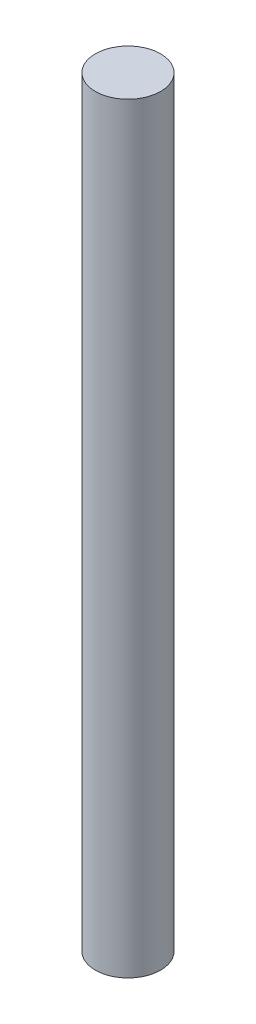
ISO-10303-21;
HEADER;
FILE_DESCRIPTION(('STEP AP214'),'2;1');
FILE_NAME('part.step','',(''),(''),'','','');
FILE_SCHEMA(('AUTOMOTIVE_DESIGN { 1 0 10303 214 1 1 1 1 }'));
ENDSEC;
DATA;
#1=APPLICATION_CONTEXT('core data for automotive mechanical design processes');
#2=APPLICATION_PROTOCOL_DEFINITION('international standard','automotive_design',2000,#1);
#3=PRODUCT_CONTEXT('',#1,'mechanical');
#4=PRODUCT('Part','Part','',(#3));
#5=PRODUCT_RELATED_PRODUCT_CATEGORY('part','',(#4));
#6=PRODUCT_DEFINITION_FORMATION('','',#4);
#7=PRODUCT_DEFINITION_CONTEXT('part definition',#1,'design');
#8=PRODUCT_DEFINITION('design','',#6,#7);
#9=PRODUCT_DEFINITION_SHAPE('','',#8);
#10=(LENGTH_UNIT() NAMED_UNIT(*) SI_UNIT(.MILLI.,.METRE.));
#11=(NAMED_UNIT(*) PLANE_ANGLE_UNIT() SI_UNIT($,.RADIAN.));
#12=(NAMED_UNIT(*) SI_UNIT($,.STERADIAN.) SOLID_ANGLE_UNIT());
#13=UNCERTAINTY_MEASURE_WITH_UNIT(LENGTH_MEASURE(1.E-05),#10,'distance_accuracy_value','');
#14=(GEOMETRIC_REPRESENTATION_CONTEXT(3) GLOBAL_UNCERTAINTY_ASSIGNED_CONTEXT((#13)) GLOBAL_UNIT_ASSIGNED_CONTEXT((#10,
#11,#12)) REPRESENTATION_CONTEXT('',''));
#15=CARTESIAN_POINT('',(0.,0.,0.));
#16=DIRECTION('',(0.,0.,1.));
#17=DIRECTION('',(1.,0.,0.));
#18=AXIS2_PLACEMENT_3D('',#15,#16,#17);
#19=CARTESIAN_POINT('',(0.,210.,0.));
#20=DIRECTION('',(0.,-1.,0.));
#21=DIRECTION('',(0.,0.,-1.));
#22=AXIS2_PLACEMENT_3D('',#19,#20,#21);
#23=CYLINDRICAL_SURFACE('',#22,9.);
#24=CARTESIAN_POINT('',(0.,210.,0.));
#25=DIRECTION('',(0.,1.,0.));
#26=DIRECTION('',(0.,0.,1.));
#27=AXIS2_PLACEMENT_3D('',#24,#25,#26);
#28=CIRCLE('',#27,9.);
#29=CARTESIAN_POINT('',(0.,210.,9.));
#30=VERTEX_POINT('',#29);
#31=EDGE_CURVE('E10',#30,#30,#28,.T.);
#32=ORIENTED_EDGE('',*,*,#31,.F.);
#33=EDGE_LOOP('',(#32));
#34=FACE_BOUND('',#33,.T.);
#35=CARTESIAN_POINT('',(0.,0.,0.));
#36=DIRECTION('',(0.,1.,0.));
#37=DIRECTION('',(0.,0.,1.));
#38=AXIS2_PLACEMENT_3D('',#35,#36,#37);
#39=CIRCLE('',#38,9.);
#40=CARTESIAN_POINT('',(0.,0.,9.));
#41=VERTEX_POINT('',#40);
#42=EDGE_CURVE('E40',#41,#41,#39,.T.);
#43=ORIENTED_EDGE('',*,*,#42,.T.);
#44=EDGE_LOOP('',(#43));
#45=FACE_BOUND('',#44,.T.);
#46=ADVANCED_FACE('F37',(#34,#45),#23,.T.);
#47=CARTESIAN_POINT('',(0.,210.,0.));
#48=DIRECTION('',(0.,1.,0.));
#49=DIRECTION('',(0.,0.,1.));
#50=AXIS2_PLACEMENT_3D('',#47,#48,#49);
#51=PLANE('',#50);
#52=ORIENTED_EDGE('',*,*,#31,.T.);
#53=EDGE_LOOP('',(#52));
#54=FACE_BOUND('',#53,.T.);
#55=ADVANCED_FACE('F52',(#54),#51,.T.);
#56=CARTESIAN_POINT('',(0.,0.,0.));
#57=DIRECTION('',(0.,1.,0.));
#58=DIRECTION('',(0.,0.,1.));
#59=AXIS2_PLACEMENT_3D('',#56,#57,#58);
#60=PLANE('',#59);
#61=ORIENTED_EDGE('',*,*,#42,.F.);
#62=EDGE_LOOP('',(#61));
#63=FACE_BOUND('',#62,.T.);
#64=ADVANCED_FACE('F50',(#63),#60,.F.);
#65=CLOSED_SHELL('',(#46,#55,#64));
#66=MANIFOLD_SOLID_BREP('B2',#65);
#67=ADVANCED_BREP_SHAPE_REPRESENTATION('',(#18,#66),#14);
#68=SHAPE_DEFINITION_REPRESENTATION(#9,#67);
ENDSEC;
END-ISO-10303-21;
